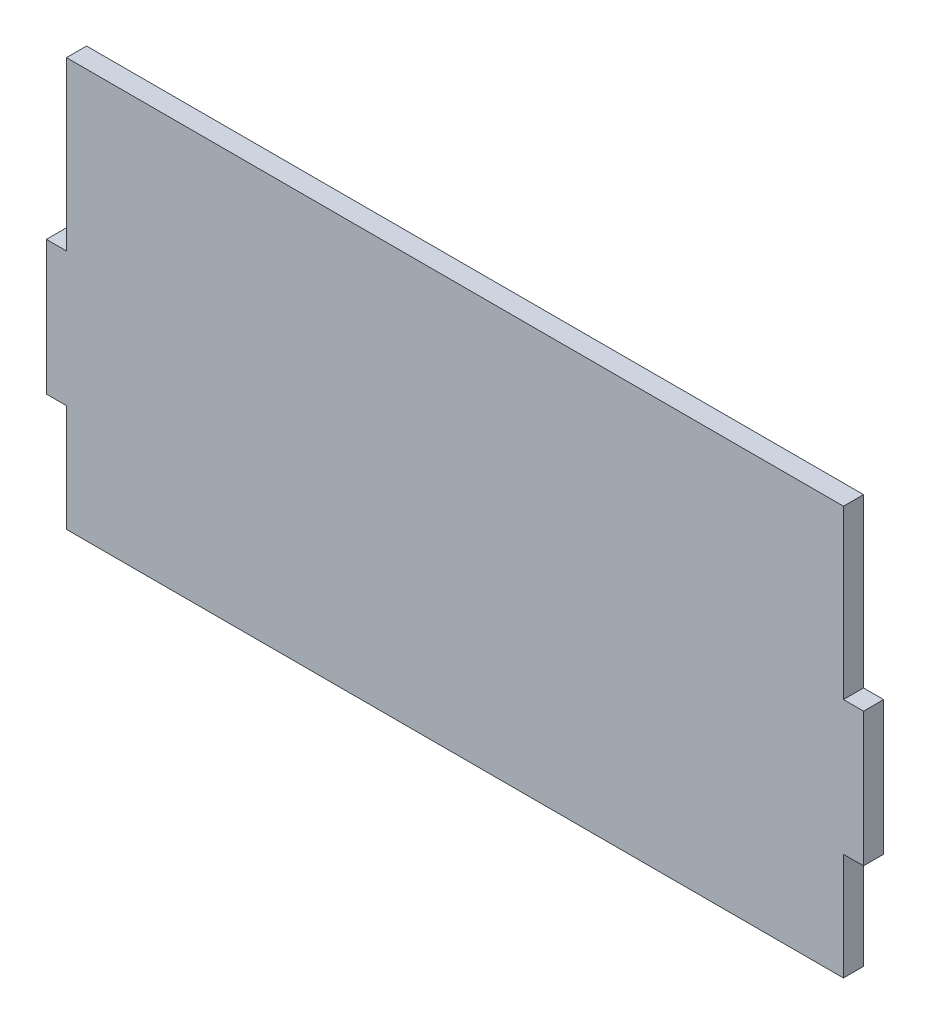
ISO-10303-21;
HEADER;
FILE_DESCRIPTION(('STEP AP214'),'2;1');
FILE_NAME('part.step','',(''),(''),'','','');
FILE_SCHEMA(('AUTOMOTIVE_DESIGN { 1 0 10303 214 1 1 1 1 }'));
ENDSEC;
DATA;
#1=APPLICATION_CONTEXT('core data for automotive mechanical design processes');
#2=APPLICATION_PROTOCOL_DEFINITION('international standard','automotive_design',2000,#1);
#3=PRODUCT_CONTEXT('',#1,'mechanical');
#4=PRODUCT('Part','Part','',(#3));
#5=PRODUCT_RELATED_PRODUCT_CATEGORY('part','',(#4));
#6=PRODUCT_DEFINITION_FORMATION('','',#4);
#7=PRODUCT_DEFINITION_CONTEXT('part definition',#1,'design');
#8=PRODUCT_DEFINITION('design','',#6,#7);
#9=PRODUCT_DEFINITION_SHAPE('','',#8);
#10=(LENGTH_UNIT() NAMED_UNIT(*) SI_UNIT(.MILLI.,.METRE.));
#11=(NAMED_UNIT(*) PLANE_ANGLE_UNIT() SI_UNIT($,.RADIAN.));
#12=(NAMED_UNIT(*) SI_UNIT($,.STERADIAN.) SOLID_ANGLE_UNIT());
#13=UNCERTAINTY_MEASURE_WITH_UNIT(LENGTH_MEASURE(1.E-05),#10,'distance_accuracy_value','');
#14=(GEOMETRIC_REPRESENTATION_CONTEXT(3) GLOBAL_UNCERTAINTY_ASSIGNED_CONTEXT((#13)) GLOBAL_UNIT_ASSIGNED_CONTEXT((#10,
#11,#12)) REPRESENTATION_CONTEXT('',''));
#15=CARTESIAN_POINT('',(0.,0.,0.));
#16=DIRECTION('',(0.,0.,1.));
#17=DIRECTION('',(1.,0.,0.));
#18=AXIS2_PLACEMENT_3D('',#15,#16,#17);
#19=CARTESIAN_POINT('',(-58.,10.,3.));
#20=DIRECTION('',(1.,0.,0.));
#21=DIRECTION('',(0.,0.,-1.));
#22=AXIS2_PLACEMENT_3D('',#19,#20,#21);
#23=PLANE('',#22);
#24=DIRECTION('',(0.,-1.,0.));
#25=VECTOR('',#24,1.);
#26=CARTESIAN_POINT('',(-58.,10.,0.));
#27=LINE('',#26,#25);
#28=CARTESIAN_POINT('',(-58.,35.,0.));
#29=VERTEX_POINT('',#28);
#30=CARTESIAN_POINT('',(-58.,10.,0.));
#31=VERTEX_POINT('',#30);
#32=EDGE_CURVE('E164',#29,#31,#27,.T.);
#33=ORIENTED_EDGE('',*,*,#32,.T.);
#34=DIRECTION('',(0.,0.,-1.));
#35=VECTOR('',#34,1.);
#36=CARTESIAN_POINT('',(-58.,10.,3.));
#37=LINE('',#36,#35);
#38=CARTESIAN_POINT('',(-58.,10.,3.));
#39=VERTEX_POINT('',#38);
#40=EDGE_CURVE('E11',#39,#31,#37,.T.);
#41=ORIENTED_EDGE('',*,*,#40,.F.);
#42=DIRECTION('',(0.,-1.,0.));
#43=VECTOR('',#42,1.);
#44=CARTESIAN_POINT('',(-58.,10.,3.));
#45=LINE('',#44,#43);
#46=CARTESIAN_POINT('',(-58.,35.,3.));
#47=VERTEX_POINT('',#46);
#48=EDGE_CURVE('E198',#47,#39,#45,.T.);
#49=ORIENTED_EDGE('',*,*,#48,.F.);
#50=DIRECTION('',(0.,0.,-1.));
#51=VECTOR('',#50,1.);
#52=CARTESIAN_POINT('',(-58.,35.,3.));
#53=LINE('',#52,#51);
#54=EDGE_CURVE('E160',#47,#29,#53,.T.);
#55=ORIENTED_EDGE('',*,*,#54,.T.);
#56=EDGE_LOOP('',(#33,#41,#49,#55));
#57=FACE_BOUND('',#56,.T.);
#58=ADVANCED_FACE('F39',(#57),#23,.F.);
#59=CARTESIAN_POINT('',(-61.,10.,3.));
#60=DIRECTION('',(0.,-1.,0.));
#61=DIRECTION('',(0.,0.,-1.));
#62=AXIS2_PLACEMENT_3D('',#59,#60,#61);
#63=PLANE('',#62);
#64=DIRECTION('',(-1.,0.,0.));
#65=VECTOR('',#64,1.);
#66=CARTESIAN_POINT('',(-61.,10.,0.));
#67=LINE('',#66,#65);
#68=CARTESIAN_POINT('',(-61.,10.,0.));
#69=VERTEX_POINT('',#68);
#70=EDGE_CURVE('E168',#31,#69,#67,.T.);
#71=ORIENTED_EDGE('',*,*,#70,.T.);
#72=DIRECTION('',(0.,0.,-1.));
#73=VECTOR('',#72,1.);
#74=CARTESIAN_POINT('',(-61.,10.,3.));
#75=LINE('',#74,#73);
#76=CARTESIAN_POINT('',(-61.,10.,3.));
#77=VERTEX_POINT('',#76);
#78=EDGE_CURVE('E48',#77,#69,#75,.T.);
#79=ORIENTED_EDGE('',*,*,#78,.F.);
#80=DIRECTION('',(-1.,0.,0.));
#81=VECTOR('',#80,1.);
#82=CARTESIAN_POINT('',(-61.,10.,3.));
#83=LINE('',#82,#81);
#84=EDGE_CURVE('E111',#39,#77,#83,.T.);
#85=ORIENTED_EDGE('',*,*,#84,.F.);
#86=ORIENTED_EDGE('',*,*,#40,.T.);
#87=EDGE_LOOP('',(#71,#79,#85,#86));
#88=FACE_BOUND('',#87,.T.);
#89=ADVANCED_FACE('F292',(#88),#63,.F.);
#90=CARTESIAN_POINT('',(-61.,-10.,3.));
#91=DIRECTION('',(1.,0.,0.));
#92=DIRECTION('',(0.,0.,-1.));
#93=AXIS2_PLACEMENT_3D('',#90,#91,#92);
#94=PLANE('',#93);
#95=DIRECTION('',(0.,-1.,0.));
#96=VECTOR('',#95,1.);
#97=CARTESIAN_POINT('',(-61.,-10.,0.));
#98=LINE('',#97,#96);
#99=CARTESIAN_POINT('',(-61.,-10.,0.));
#100=VERTEX_POINT('',#99);
#101=EDGE_CURVE('E171',#69,#100,#98,.T.);
#102=ORIENTED_EDGE('',*,*,#101,.T.);
#103=DIRECTION('',(0.,0.,-1.));
#104=VECTOR('',#103,1.);
#105=CARTESIAN_POINT('',(-61.,-10.,3.));
#106=LINE('',#105,#104);
#107=CARTESIAN_POINT('',(-61.,-10.,3.));
#108=VERTEX_POINT('',#107);
#109=EDGE_CURVE('E225',#108,#100,#106,.T.);
#110=ORIENTED_EDGE('',*,*,#109,.F.);
#111=DIRECTION('',(0.,-1.,0.));
#112=VECTOR('',#111,1.);
#113=CARTESIAN_POINT('',(-61.,-10.,3.));
#114=LINE('',#113,#112);
#115=EDGE_CURVE('E235',#77,#108,#114,.T.);
#116=ORIENTED_EDGE('',*,*,#115,.F.);
#117=ORIENTED_EDGE('',*,*,#78,.T.);
#118=EDGE_LOOP('',(#102,#110,#116,#117));
#119=FACE_BOUND('',#118,.T.);
#120=ADVANCED_FACE('F233',(#119),#94,.F.);
#121=CARTESIAN_POINT('',(-58.,-10.,3.));
#122=DIRECTION('',(0.,1.,0.));
#123=DIRECTION('',(-1.,0.,0.));
#124=AXIS2_PLACEMENT_3D('',#121,#122,#123);
#125=PLANE('',#124);
#126=DIRECTION('',(1.,0.,0.));
#127=VECTOR('',#126,1.);
#128=CARTESIAN_POINT('',(-58.,-10.,0.));
#129=LINE('',#128,#127);
#130=CARTESIAN_POINT('',(-58.,-10.,0.));
#131=VERTEX_POINT('',#130);
#132=EDGE_CURVE('E174',#100,#131,#129,.T.);
#133=ORIENTED_EDGE('',*,*,#132,.T.);
#134=DIRECTION('',(0.,0.,-1.));
#135=VECTOR('',#134,1.);
#136=CARTESIAN_POINT('',(-58.,-10.,3.));
#137=LINE('',#136,#135);
#138=CARTESIAN_POINT('',(-58.,-10.,3.));
#139=VERTEX_POINT('',#138);
#140=EDGE_CURVE('E221',#139,#131,#137,.T.);
#141=ORIENTED_EDGE('',*,*,#140,.F.);
#142=DIRECTION('',(1.,0.,0.));
#143=VECTOR('',#142,1.);
#144=CARTESIAN_POINT('',(-58.,-10.,3.));
#145=LINE('',#144,#143);
#146=EDGE_CURVE('E254',#108,#139,#145,.T.);
#147=ORIENTED_EDGE('',*,*,#146,.F.);
#148=ORIENTED_EDGE('',*,*,#109,.T.);
#149=EDGE_LOOP('',(#133,#141,#147,#148));
#150=FACE_BOUND('',#149,.T.);
#151=ADVANCED_FACE('F244',(#150),#125,.F.);
#152=CARTESIAN_POINT('',(-58.,-26.,3.));
#153=DIRECTION('',(1.,0.,0.));
#154=DIRECTION('',(0.,0.,-1.));
#155=AXIS2_PLACEMENT_3D('',#152,#153,#154);
#156=PLANE('',#155);
#157=DIRECTION('',(0.,-1.,0.));
#158=VECTOR('',#157,1.);
#159=CARTESIAN_POINT('',(-58.,-26.,0.));
#160=LINE('',#159,#158);
#161=CARTESIAN_POINT('',(-58.,-26.,0.));
#162=VERTEX_POINT('',#161);
#163=EDGE_CURVE('E177',#131,#162,#160,.T.);
#164=ORIENTED_EDGE('',*,*,#163,.T.);
#165=DIRECTION('',(0.,0.,-1.));
#166=VECTOR('',#165,1.);
#167=CARTESIAN_POINT('',(-58.,-26.,3.));
#168=LINE('',#167,#166);
#169=CARTESIAN_POINT('',(-58.,-26.,3.));
#170=VERTEX_POINT('',#169);
#171=EDGE_CURVE('E217',#170,#162,#168,.T.);
#172=ORIENTED_EDGE('',*,*,#171,.F.);
#173=DIRECTION('',(0.,-1.,0.));
#174=VECTOR('',#173,1.);
#175=CARTESIAN_POINT('',(-58.,-26.,3.));
#176=LINE('',#175,#174);
#177=EDGE_CURVE('E250',#139,#170,#176,.T.);
#178=ORIENTED_EDGE('',*,*,#177,.F.);
#179=ORIENTED_EDGE('',*,*,#140,.T.);
#180=EDGE_LOOP('',(#164,#172,#178,#179));
#181=FACE_BOUND('',#180,.T.);
#182=ADVANCED_FACE('F248',(#181),#156,.F.);
#183=CARTESIAN_POINT('',(58.,-26.,3.));
#184=DIRECTION('',(0.,1.,0.));
#185=DIRECTION('',(0.,0.,1.));
#186=AXIS2_PLACEMENT_3D('',#183,#184,#185);
#187=PLANE('',#186);
#188=DIRECTION('',(1.,0.,0.));
#189=VECTOR('',#188,1.);
#190=CARTESIAN_POINT('',(58.,-26.,0.));
#191=LINE('',#190,#189);
#192=CARTESIAN_POINT('',(58.,-26.,0.));
#193=VERTEX_POINT('',#192);
#194=EDGE_CURVE('E180',#162,#193,#191,.T.);
#195=ORIENTED_EDGE('',*,*,#194,.T.);
#196=DIRECTION('',(0.,0.,-1.));
#197=VECTOR('',#196,1.);
#198=CARTESIAN_POINT('',(58.,-26.,3.));
#199=LINE('',#198,#197);
#200=CARTESIAN_POINT('',(58.,-26.,3.));
#201=VERTEX_POINT('',#200);
#202=EDGE_CURVE('E213',#201,#193,#199,.T.);
#203=ORIENTED_EDGE('',*,*,#202,.F.);
#204=DIRECTION('',(1.,0.,0.));
#205=VECTOR('',#204,1.);
#206=CARTESIAN_POINT('',(58.,-26.,3.));
#207=LINE('',#206,#205);
#208=EDGE_CURVE('E253',#170,#201,#207,.T.);
#209=ORIENTED_EDGE('',*,*,#208,.F.);
#210=ORIENTED_EDGE('',*,*,#171,.T.);
#211=EDGE_LOOP('',(#195,#203,#209,#210));
#212=FACE_BOUND('',#211,.T.);
#213=ADVANCED_FACE('F305',(#212),#187,.F.);
#214=CARTESIAN_POINT('',(58.,-10.,3.));
#215=DIRECTION('',(-1.,0.,0.));
#216=DIRECTION('',(0.,0.,1.));
#217=AXIS2_PLACEMENT_3D('',#214,#215,#216);
#218=PLANE('',#217);
#219=DIRECTION('',(0.,1.,0.));
#220=VECTOR('',#219,1.);
#221=CARTESIAN_POINT('',(58.,-10.,0.));
#222=LINE('',#221,#220);
#223=CARTESIAN_POINT('',(58.,-10.,0.));
#224=VERTEX_POINT('',#223);
#225=EDGE_CURVE('E183',#193,#224,#222,.T.);
#226=ORIENTED_EDGE('',*,*,#225,.T.);
#227=DIRECTION('',(0.,0.,-1.));
#228=VECTOR('',#227,1.);
#229=CARTESIAN_POINT('',(58.,-10.,3.));
#230=LINE('',#229,#228);
#231=CARTESIAN_POINT('',(58.,-10.,3.));
#232=VERTEX_POINT('',#231);
#233=EDGE_CURVE('E209',#232,#224,#230,.T.);
#234=ORIENTED_EDGE('',*,*,#233,.F.);
#235=DIRECTION('',(0.,1.,0.));
#236=VECTOR('',#235,1.);
#237=CARTESIAN_POINT('',(58.,-10.,3.));
#238=LINE('',#237,#236);
#239=EDGE_CURVE('E258',#201,#232,#238,.T.);
#240=ORIENTED_EDGE('',*,*,#239,.F.);
#241=ORIENTED_EDGE('',*,*,#202,.T.);
#242=EDGE_LOOP('',(#226,#234,#240,#241));
#243=FACE_BOUND('',#242,.T.);
#244=ADVANCED_FACE('F308',(#243),#218,.F.);
#245=CARTESIAN_POINT('',(61.,-10.,3.));
#246=DIRECTION('',(0.,1.,0.));
#247=DIRECTION('',(-1.,0.,0.));
#248=AXIS2_PLACEMENT_3D('',#245,#246,#247);
#249=PLANE('',#248);
#250=DIRECTION('',(1.,0.,0.));
#251=VECTOR('',#250,1.);
#252=CARTESIAN_POINT('',(61.,-10.,0.));
#253=LINE('',#252,#251);
#254=CARTESIAN_POINT('',(61.,-10.,0.));
#255=VERTEX_POINT('',#254);
#256=EDGE_CURVE('E186',#224,#255,#253,.T.);
#257=ORIENTED_EDGE('',*,*,#256,.T.);
#258=DIRECTION('',(0.,0.,-1.));
#259=VECTOR('',#258,1.);
#260=CARTESIAN_POINT('',(61.,-10.,3.));
#261=LINE('',#260,#259);
#262=CARTESIAN_POINT('',(61.,-10.,3.));
#263=VERTEX_POINT('',#262);
#264=EDGE_CURVE('E205',#263,#255,#261,.T.);
#265=ORIENTED_EDGE('',*,*,#264,.F.);
#266=DIRECTION('',(1.,0.,0.));
#267=VECTOR('',#266,1.);
#268=CARTESIAN_POINT('',(61.,-10.,3.));
#269=LINE('',#268,#267);
#270=EDGE_CURVE('E265',#232,#263,#269,.T.);
#271=ORIENTED_EDGE('',*,*,#270,.F.);
#272=ORIENTED_EDGE('',*,*,#233,.T.);
#273=EDGE_LOOP('',(#257,#265,#271,#272));
#274=FACE_BOUND('',#273,.T.);
#275=ADVANCED_FACE('F273',(#274),#249,.F.);
#276=CARTESIAN_POINT('',(61.,10.,3.));
#277=DIRECTION('',(-1.,0.,0.));
#278=DIRECTION('',(0.,0.,1.));
#279=AXIS2_PLACEMENT_3D('',#276,#277,#278);
#280=PLANE('',#279);
#281=DIRECTION('',(0.,1.,0.));
#282=VECTOR('',#281,1.);
#283=CARTESIAN_POINT('',(61.,10.,0.));
#284=LINE('',#283,#282);
#285=CARTESIAN_POINT('',(61.,10.,0.));
#286=VERTEX_POINT('',#285);
#287=EDGE_CURVE('E189',#255,#286,#284,.T.);
#288=ORIENTED_EDGE('',*,*,#287,.T.);
#289=DIRECTION('',(0.,0.,-1.));
#290=VECTOR('',#289,1.);
#291=CARTESIAN_POINT('',(61.,10.,3.));
#292=LINE('',#291,#290);
#293=CARTESIAN_POINT('',(61.,10.,3.));
#294=VERTEX_POINT('',#293);
#295=EDGE_CURVE('E153',#294,#286,#292,.T.);
#296=ORIENTED_EDGE('',*,*,#295,.F.);
#297=DIRECTION('',(0.,1.,0.));
#298=VECTOR('',#297,1.);
#299=CARTESIAN_POINT('',(61.,10.,3.));
#300=LINE('',#299,#298);
#301=EDGE_CURVE('E142',#263,#294,#300,.T.);
#302=ORIENTED_EDGE('',*,*,#301,.F.);
#303=ORIENTED_EDGE('',*,*,#264,.T.);
#304=EDGE_LOOP('',(#288,#296,#302,#303));
#305=FACE_BOUND('',#304,.T.);
#306=ADVANCED_FACE('F277',(#305),#280,.F.);
#307=CARTESIAN_POINT('',(58.,10.,3.));
#308=DIRECTION('',(0.,-1.,0.));
#309=DIRECTION('',(0.,0.,-1.));
#310=AXIS2_PLACEMENT_3D('',#307,#308,#309);
#311=PLANE('',#310);
#312=DIRECTION('',(-1.,0.,0.));
#313=VECTOR('',#312,1.);
#314=CARTESIAN_POINT('',(58.,10.,0.));
#315=LINE('',#314,#313);
#316=CARTESIAN_POINT('',(58.,10.,0.));
#317=VERTEX_POINT('',#316);
#318=EDGE_CURVE('E151',#286,#317,#315,.T.);
#319=ORIENTED_EDGE('',*,*,#318,.T.);
#320=DIRECTION('',(0.,0.,-1.));
#321=VECTOR('',#320,1.);
#322=CARTESIAN_POINT('',(58.,10.,3.));
#323=LINE('',#322,#321);
#324=CARTESIAN_POINT('',(58.,10.,3.));
#325=VERTEX_POINT('',#324);
#326=EDGE_CURVE('E148',#325,#317,#323,.T.);
#327=ORIENTED_EDGE('',*,*,#326,.F.);
#328=DIRECTION('',(-1.,0.,0.));
#329=VECTOR('',#328,1.);
#330=CARTESIAN_POINT('',(58.,10.,3.));
#331=LINE('',#330,#329);
#332=EDGE_CURVE('E136',#294,#325,#331,.T.);
#333=ORIENTED_EDGE('',*,*,#332,.F.);
#334=ORIENTED_EDGE('',*,*,#295,.T.);
#335=EDGE_LOOP('',(#319,#327,#333,#334));
#336=FACE_BOUND('',#335,.T.);
#337=ADVANCED_FACE('F149',(#336),#311,.F.);
#338=CARTESIAN_POINT('',(58.,35.,3.));
#339=DIRECTION('',(-1.,0.,0.));
#340=DIRECTION('',(0.,0.,1.));
#341=AXIS2_PLACEMENT_3D('',#338,#339,#340);
#342=PLANE('',#341);
#343=DIRECTION('',(0.,1.,0.));
#344=VECTOR('',#343,1.);
#345=CARTESIAN_POINT('',(58.,35.,0.));
#346=LINE('',#345,#344);
#347=CARTESIAN_POINT('',(58.,35.,0.));
#348=VERTEX_POINT('',#347);
#349=EDGE_CURVE('E97',#317,#348,#346,.T.);
#350=ORIENTED_EDGE('',*,*,#349,.T.);
#351=DIRECTION('',(0.,0.,-1.));
#352=VECTOR('',#351,1.);
#353=CARTESIAN_POINT('',(58.,35.,3.));
#354=LINE('',#353,#352);
#355=CARTESIAN_POINT('',(58.,35.,3.));
#356=VERTEX_POINT('',#355);
#357=EDGE_CURVE('E154',#356,#348,#354,.T.);
#358=ORIENTED_EDGE('',*,*,#357,.F.);
#359=DIRECTION('',(0.,1.,0.));
#360=VECTOR('',#359,1.);
#361=CARTESIAN_POINT('',(58.,35.,3.));
#362=LINE('',#361,#360);
#363=EDGE_CURVE('E140',#325,#356,#362,.T.);
#364=ORIENTED_EDGE('',*,*,#363,.F.);
#365=ORIENTED_EDGE('',*,*,#326,.T.);
#366=EDGE_LOOP('',(#350,#358,#364,#365));
#367=FACE_BOUND('',#366,.T.);
#368=ADVANCED_FACE('F156',(#367),#342,.F.);
#369=CARTESIAN_POINT('',(-58.,35.,3.));
#370=DIRECTION('',(0.,-1.,0.));
#371=DIRECTION('',(0.,0.,-1.));
#372=AXIS2_PLACEMENT_3D('',#369,#370,#371);
#373=PLANE('',#372);
#374=DIRECTION('',(-1.,0.,0.));
#375=VECTOR('',#374,1.);
#376=CARTESIAN_POINT('',(-58.,35.,0.));
#377=LINE('',#376,#375);
#378=EDGE_CURVE('E103',#348,#29,#377,.T.);
#379=ORIENTED_EDGE('',*,*,#378,.T.);
#380=ORIENTED_EDGE('',*,*,#54,.F.);
#381=DIRECTION('',(-1.,0.,0.));
#382=VECTOR('',#381,1.);
#383=CARTESIAN_POINT('',(-58.,35.,3.));
#384=LINE('',#383,#382);
#385=EDGE_CURVE('E56',#356,#47,#384,.T.);
#386=ORIENTED_EDGE('',*,*,#385,.F.);
#387=ORIENTED_EDGE('',*,*,#357,.T.);
#388=EDGE_LOOP('',(#379,#380,#386,#387));
#389=FACE_BOUND('',#388,.T.);
#390=ADVANCED_FACE('F281',(#389),#373,.F.);
#391=CARTESIAN_POINT('',(0.,0.,3.));
#392=DIRECTION('',(0.,0.,-1.));
#393=DIRECTION('',(-1.,0.,0.));
#394=AXIS2_PLACEMENT_3D('',#391,#392,#393);
#395=PLANE('',#394);
#396=ORIENTED_EDGE('',*,*,#48,.T.);
#397=ORIENTED_EDGE('',*,*,#84,.T.);
#398=ORIENTED_EDGE('',*,*,#115,.T.);
#399=ORIENTED_EDGE('',*,*,#146,.T.);
#400=ORIENTED_EDGE('',*,*,#177,.T.);
#401=ORIENTED_EDGE('',*,*,#208,.T.);
#402=ORIENTED_EDGE('',*,*,#239,.T.);
#403=ORIENTED_EDGE('',*,*,#270,.T.);
#404=ORIENTED_EDGE('',*,*,#301,.T.);
#405=ORIENTED_EDGE('',*,*,#332,.T.);
#406=ORIENTED_EDGE('',*,*,#363,.T.);
#407=ORIENTED_EDGE('',*,*,#385,.T.);
#408=EDGE_LOOP('',(#396,#397,#398,#399,#400,#401,#402,#403,#404,#405,#406,#407));
#409=FACE_BOUND('',#408,.T.);
#410=ADVANCED_FACE('F138',(#409),#395,.F.);
#411=CARTESIAN_POINT('',(0.,0.,0.));
#412=DIRECTION('',(0.,0.,-1.));
#413=DIRECTION('',(-1.,0.,0.));
#414=AXIS2_PLACEMENT_3D('',#411,#412,#413);
#415=PLANE('',#414);
#416=ORIENTED_EDGE('',*,*,#32,.F.);
#417=ORIENTED_EDGE('',*,*,#378,.F.);
#418=ORIENTED_EDGE('',*,*,#349,.F.);
#419=ORIENTED_EDGE('',*,*,#318,.F.);
#420=ORIENTED_EDGE('',*,*,#287,.F.);
#421=ORIENTED_EDGE('',*,*,#256,.F.);
#422=ORIENTED_EDGE('',*,*,#225,.F.);
#423=ORIENTED_EDGE('',*,*,#194,.F.);
#424=ORIENTED_EDGE('',*,*,#163,.F.);
#425=ORIENTED_EDGE('',*,*,#132,.F.);
#426=ORIENTED_EDGE('',*,*,#101,.F.);
#427=ORIENTED_EDGE('',*,*,#70,.F.);
#428=EDGE_LOOP('',(#416,#417,#418,#419,#420,#421,#422,#423,#424,#425,#426,#427));
#429=FACE_BOUND('',#428,.T.);
#430=ADVANCED_FACE('F239',(#429),#415,.T.);
#431=CLOSED_SHELL('',(#58,#89,#120,#151,#182,#213,#244,#275,#306,#337,#368,#390,#410,#430));
#432=MANIFOLD_SOLID_BREP('B2',#431);
#433=ADVANCED_BREP_SHAPE_REPRESENTATION('',(#18,#432),#14);
#434=SHAPE_DEFINITION_REPRESENTATION(#9,#433);
ENDSEC;
END-ISO-10303-21;
